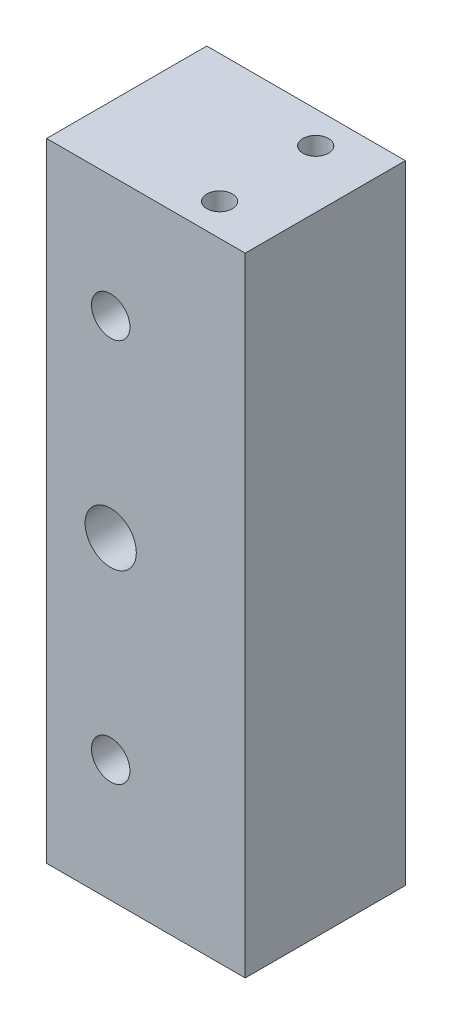
ISO-10303-21;
HEADER;
FILE_DESCRIPTION(('STEP AP214'),'2;1');
FILE_NAME('part.step','',(''),(''),'','','');
FILE_SCHEMA(('AUTOMOTIVE_DESIGN { 1 0 10303 214 1 1 1 1 }'));
ENDSEC;
DATA;
#1=APPLICATION_CONTEXT('core data for automotive mechanical design processes');
#2=APPLICATION_PROTOCOL_DEFINITION('international standard','automotive_design',2000,#1);
#3=PRODUCT_CONTEXT('',#1,'mechanical');
#4=PRODUCT('Part','Part','',(#3));
#5=PRODUCT_RELATED_PRODUCT_CATEGORY('part','',(#4));
#6=PRODUCT_DEFINITION_FORMATION('','',#4);
#7=PRODUCT_DEFINITION_CONTEXT('part definition',#1,'design');
#8=PRODUCT_DEFINITION('design','',#6,#7);
#9=PRODUCT_DEFINITION_SHAPE('','',#8);
#10=(LENGTH_UNIT() NAMED_UNIT(*) SI_UNIT(.MILLI.,.METRE.));
#11=(NAMED_UNIT(*) PLANE_ANGLE_UNIT() SI_UNIT($,.RADIAN.));
#12=(NAMED_UNIT(*) SI_UNIT($,.STERADIAN.) SOLID_ANGLE_UNIT());
#13=UNCERTAINTY_MEASURE_WITH_UNIT(LENGTH_MEASURE(1.E-05),#10,'distance_accuracy_value','');
#14=(GEOMETRIC_REPRESENTATION_CONTEXT(3) GLOBAL_UNCERTAINTY_ASSIGNED_CONTEXT((#13)) GLOBAL_UNIT_ASSIGNED_CONTEXT((#10,
#11,#12)) REPRESENTATION_CONTEXT('',''));
#15=CARTESIAN_POINT('',(0.,0.,0.));
#16=DIRECTION('',(0.,0.,1.));
#17=DIRECTION('',(1.,0.,0.));
#18=AXIS2_PLACEMENT_3D('',#15,#16,#17);
#19=CARTESIAN_POINT('',(0.,0.,25.));
#20=DIRECTION('',(0.,0.,-1.));
#21=DIRECTION('',(-1.,0.,0.));
#22=AXIS2_PLACEMENT_3D('',#19,#20,#21);
#23=PLANE('',#22);
#24=DIRECTION('',(1.,0.,0.));
#25=VECTOR('',#24,1.);
#26=CARTESIAN_POINT('',(-10.,-49.,25.));
#27=LINE('',#26,#25);
#28=CARTESIAN_POINT('',(-10.,-49.,25.));
#29=VERTEX_POINT('',#28);
#30=CARTESIAN_POINT('',(21.,-49.,25.));
#31=VERTEX_POINT('',#30);
#32=EDGE_CURVE('E67',#29,#31,#27,.T.);
#33=ORIENTED_EDGE('',*,*,#32,.T.);
#34=DIRECTION('',(0.,-1.,0.));
#35=VECTOR('',#34,1.);
#36=CARTESIAN_POINT('',(21.,-49.,25.));
#37=LINE('',#36,#35);
#38=CARTESIAN_POINT('',(21.,49.,25.));
#39=VERTEX_POINT('',#38);
#40=EDGE_CURVE('E94',#39,#31,#37,.T.);
#41=ORIENTED_EDGE('',*,*,#40,.F.);
#42=DIRECTION('',(-1.,0.,0.));
#43=VECTOR('',#42,1.);
#44=CARTESIAN_POINT('',(-10.,49.,25.));
#45=LINE('',#44,#43);
#46=CARTESIAN_POINT('',(-10.,49.,25.));
#47=VERTEX_POINT('',#46);
#48=EDGE_CURVE('E86',#39,#47,#45,.T.);
#49=ORIENTED_EDGE('',*,*,#48,.T.);
#50=DIRECTION('',(0.,-1.,0.));
#51=VECTOR('',#50,1.);
#52=CARTESIAN_POINT('',(-10.,-49.,25.));
#53=LINE('',#52,#51);
#54=EDGE_CURVE('E50',#47,#29,#53,.T.);
#55=ORIENTED_EDGE('',*,*,#54,.T.);
#56=EDGE_LOOP('',(#33,#41,#49,#55));
#57=FACE_BOUND('',#56,.T.);
#58=CARTESIAN_POINT('',(0.,0.,25.));
#59=DIRECTION('',(0.,0.,1.));
#60=DIRECTION('',(1.,0.,0.));
#61=AXIS2_PLACEMENT_3D('',#58,#59,#60);
#62=CIRCLE('',#61,4.);
#63=CARTESIAN_POINT('',(4.,0.,25.));
#64=VERTEX_POINT('',#63);
#65=EDGE_CURVE('E121',#64,#64,#62,.T.);
#66=ORIENTED_EDGE('',*,*,#65,.F.);
#67=EDGE_LOOP('',(#66));
#68=FACE_BOUND('',#67,.T.);
#69=CARTESIAN_POINT('',(0.,-30.,25.));
#70=DIRECTION('',(0.,0.,1.));
#71=DIRECTION('',(1.,0.,0.));
#72=AXIS2_PLACEMENT_3D('',#69,#70,#71);
#73=CIRCLE('',#72,3.);
#74=CARTESIAN_POINT('',(3.00000000000001,-30.,25.));
#75=VERTEX_POINT('',#74);
#76=EDGE_CURVE('E115',#75,#75,#73,.T.);
#77=ORIENTED_EDGE('',*,*,#76,.F.);
#78=EDGE_LOOP('',(#77));
#79=FACE_BOUND('',#78,.T.);
#80=CARTESIAN_POINT('',(0.,30.,25.));
#81=DIRECTION('',(0.,0.,1.));
#82=DIRECTION('',(1.,0.,0.));
#83=AXIS2_PLACEMENT_3D('',#80,#81,#82);
#84=CIRCLE('',#83,3.);
#85=CARTESIAN_POINT('',(3.,30.,25.));
#86=VERTEX_POINT('',#85);
#87=EDGE_CURVE('E109',#86,#86,#84,.T.);
#88=ORIENTED_EDGE('',*,*,#87,.F.);
#89=EDGE_LOOP('',(#88));
#90=FACE_BOUND('',#89,.T.);
#91=ADVANCED_FACE('F33',(#57,#68,#79,#90),#23,.F.);
#92=CARTESIAN_POINT('',(0.,0.,0.));
#93=DIRECTION('',(0.,0.,-1.));
#94=DIRECTION('',(-1.,0.,0.));
#95=AXIS2_PLACEMENT_3D('',#92,#93,#94);
#96=PLANE('',#95);
#97=CARTESIAN_POINT('',(0.,-30.,0.));
#98=DIRECTION('',(0.,0.,1.));
#99=DIRECTION('',(1.,0.,0.));
#100=AXIS2_PLACEMENT_3D('',#97,#98,#99);
#101=CIRCLE('',#100,3.);
#102=CARTESIAN_POINT('',(3.00000000000001,-30.,0.));
#103=VERTEX_POINT('',#102);
#104=EDGE_CURVE('E112',#103,#103,#101,.T.);
#105=ORIENTED_EDGE('',*,*,#104,.T.);
#106=EDGE_LOOP('',(#105));
#107=FACE_BOUND('',#106,.T.);
#108=DIRECTION('',(-1.,0.,0.));
#109=VECTOR('',#108,1.);
#110=CARTESIAN_POINT('',(-10.,49.,0.));
#111=LINE('',#110,#109);
#112=CARTESIAN_POINT('',(21.,49.,0.));
#113=VERTEX_POINT('',#112);
#114=CARTESIAN_POINT('',(-10.,49.,0.));
#115=VERTEX_POINT('',#114);
#116=EDGE_CURVE('E61',#113,#115,#111,.T.);
#117=ORIENTED_EDGE('',*,*,#116,.F.);
#118=DIRECTION('',(0.,-1.,0.));
#119=VECTOR('',#118,1.);
#120=CARTESIAN_POINT('',(21.,-49.,0.));
#121=LINE('',#120,#119);
#122=CARTESIAN_POINT('',(21.,-49.,0.));
#123=VERTEX_POINT('',#122);
#124=EDGE_CURVE('E93',#113,#123,#121,.T.);
#125=ORIENTED_EDGE('',*,*,#124,.T.);
#126=DIRECTION('',(1.,0.,0.));
#127=VECTOR('',#126,1.);
#128=CARTESIAN_POINT('',(-10.,-49.,0.));
#129=LINE('',#128,#127);
#130=CARTESIAN_POINT('',(-10.,-49.,0.));
#131=VERTEX_POINT('',#130);
#132=EDGE_CURVE('E78',#131,#123,#129,.T.);
#133=ORIENTED_EDGE('',*,*,#132,.F.);
#134=DIRECTION('',(0.,-1.,0.));
#135=VECTOR('',#134,1.);
#136=CARTESIAN_POINT('',(-10.,-49.,0.));
#137=LINE('',#136,#135);
#138=EDGE_CURVE('E87',#115,#131,#137,.T.);
#139=ORIENTED_EDGE('',*,*,#138,.F.);
#140=EDGE_LOOP('',(#117,#125,#133,#139));
#141=FACE_BOUND('',#140,.T.);
#142=CARTESIAN_POINT('',(0.,0.,0.));
#143=DIRECTION('',(0.,0.,1.));
#144=DIRECTION('',(1.,0.,0.));
#145=AXIS2_PLACEMENT_3D('',#142,#143,#144);
#146=CIRCLE('',#145,4.);
#147=CARTESIAN_POINT('',(4.,0.,0.));
#148=VERTEX_POINT('',#147);
#149=EDGE_CURVE('E118',#148,#148,#146,.T.);
#150=ORIENTED_EDGE('',*,*,#149,.T.);
#151=EDGE_LOOP('',(#150));
#152=FACE_BOUND('',#151,.T.);
#153=CARTESIAN_POINT('',(0.,30.,0.));
#154=DIRECTION('',(0.,0.,1.));
#155=DIRECTION('',(1.,0.,0.));
#156=AXIS2_PLACEMENT_3D('',#153,#154,#155);
#157=CIRCLE('',#156,3.);
#158=CARTESIAN_POINT('',(3.,30.,0.));
#159=VERTEX_POINT('',#158);
#160=EDGE_CURVE('E95',#159,#159,#157,.T.);
#161=ORIENTED_EDGE('',*,*,#160,.T.);
#162=EDGE_LOOP('',(#161));
#163=FACE_BOUND('',#162,.T.);
#164=ADVANCED_FACE('F98',(#107,#141,#152,#163),#96,.T.);
#165=CARTESIAN_POINT('',(-10.,49.,25.));
#166=DIRECTION('',(0.,-1.,0.));
#167=DIRECTION('',(0.,0.,-1.));
#168=AXIS2_PLACEMENT_3D('',#165,#166,#167);
#169=PLANE('',#168);
#170=CARTESIAN_POINT('',(12.,49.,5.));
#171=DIRECTION('',(0.,1.,0.));
#172=DIRECTION('',(0.,0.,1.));
#173=AXIS2_PLACEMENT_3D('',#170,#171,#172);
#174=CIRCLE('',#173,2.);
#175=CARTESIAN_POINT('',(12.,49.,7.));
#176=VERTEX_POINT('',#175);
#177=EDGE_CURVE('E104',#176,#176,#174,.T.);
#178=ORIENTED_EDGE('',*,*,#177,.F.);
#179=EDGE_LOOP('',(#178));
#180=FACE_BOUND('',#179,.T.);
#181=CARTESIAN_POINT('',(12.,49.,20.));
#182=DIRECTION('',(0.,1.,0.));
#183=DIRECTION('',(0.,0.,1.));
#184=AXIS2_PLACEMENT_3D('',#181,#182,#183);
#185=CIRCLE('',#184,2.00000000000001);
#186=CARTESIAN_POINT('',(12.,49.,22.));
#187=VERTEX_POINT('',#186);
#188=EDGE_CURVE('E315',#187,#187,#185,.T.);
#189=ORIENTED_EDGE('',*,*,#188,.F.);
#190=EDGE_LOOP('',(#189));
#191=FACE_BOUND('',#190,.T.);
#192=ORIENTED_EDGE('',*,*,#116,.T.);
#193=DIRECTION('',(0.,0.,-1.));
#194=VECTOR('',#193,1.);
#195=CARTESIAN_POINT('',(-10.,49.,25.));
#196=LINE('',#195,#194);
#197=EDGE_CURVE('E11',#47,#115,#196,.T.);
#198=ORIENTED_EDGE('',*,*,#197,.F.);
#199=ORIENTED_EDGE('',*,*,#48,.F.);
#200=DIRECTION('',(0.,0.,-1.));
#201=VECTOR('',#200,1.);
#202=CARTESIAN_POINT('',(21.,49.,25.));
#203=LINE('',#202,#201);
#204=EDGE_CURVE('E96',#39,#113,#203,.T.);
#205=ORIENTED_EDGE('',*,*,#204,.T.);
#206=EDGE_LOOP('',(#192,#198,#199,#205));
#207=FACE_BOUND('',#206,.T.);
#208=ADVANCED_FACE('F35',(#180,#191,#207),#169,.F.);
#209=CARTESIAN_POINT('',(-10.,-49.,25.));
#210=DIRECTION('',(1.,0.,0.));
#211=DIRECTION('',(0.,0.,-1.));
#212=AXIS2_PLACEMENT_3D('',#209,#210,#211);
#213=PLANE('',#212);
#214=ORIENTED_EDGE('',*,*,#138,.T.);
#215=DIRECTION('',(0.,0.,-1.));
#216=VECTOR('',#215,1.);
#217=CARTESIAN_POINT('',(-10.,-49.,25.));
#218=LINE('',#217,#216);
#219=EDGE_CURVE('E42',#29,#131,#218,.T.);
#220=ORIENTED_EDGE('',*,*,#219,.F.);
#221=ORIENTED_EDGE('',*,*,#54,.F.);
#222=ORIENTED_EDGE('',*,*,#197,.T.);
#223=EDGE_LOOP('',(#214,#220,#221,#222));
#224=FACE_BOUND('',#223,.T.);
#225=ADVANCED_FACE('F131',(#224),#213,.F.);
#226=CARTESIAN_POINT('',(-10.,-49.,25.));
#227=DIRECTION('',(0.,1.,0.));
#228=DIRECTION('',(0.,0.,1.));
#229=AXIS2_PLACEMENT_3D('',#226,#227,#228);
#230=PLANE('',#229);
#231=CARTESIAN_POINT('',(12.,-49.,5.));
#232=DIRECTION('',(0.,1.,0.));
#233=DIRECTION('',(0.,0.,1.));
#234=AXIS2_PLACEMENT_3D('',#231,#232,#233);
#235=CIRCLE('',#234,2.);
#236=CARTESIAN_POINT('',(12.,-49.,7.));
#237=VERTEX_POINT('',#236);
#238=EDGE_CURVE('E316',#237,#237,#235,.T.);
#239=ORIENTED_EDGE('',*,*,#238,.T.);
#240=EDGE_LOOP('',(#239));
#241=FACE_BOUND('',#240,.T.);
#242=CARTESIAN_POINT('',(12.,-49.,20.));
#243=DIRECTION('',(0.,1.,0.));
#244=DIRECTION('',(0.,0.,1.));
#245=AXIS2_PLACEMENT_3D('',#242,#243,#244);
#246=CIRCLE('',#245,2.00000000000001);
#247=CARTESIAN_POINT('',(12.,-49.,22.));
#248=VERTEX_POINT('',#247);
#249=EDGE_CURVE('E326',#248,#248,#246,.T.);
#250=ORIENTED_EDGE('',*,*,#249,.T.);
#251=EDGE_LOOP('',(#250));
#252=FACE_BOUND('',#251,.T.);
#253=ORIENTED_EDGE('',*,*,#132,.T.);
#254=DIRECTION('',(0.,0.,-1.));
#255=VECTOR('',#254,1.);
#256=CARTESIAN_POINT('',(21.,-49.,25.));
#257=LINE('',#256,#255);
#258=EDGE_CURVE('E81',#31,#123,#257,.T.);
#259=ORIENTED_EDGE('',*,*,#258,.F.);
#260=ORIENTED_EDGE('',*,*,#32,.F.);
#261=ORIENTED_EDGE('',*,*,#219,.T.);
#262=EDGE_LOOP('',(#253,#259,#260,#261));
#263=FACE_BOUND('',#262,.T.);
#264=ADVANCED_FACE('F80',(#241,#252,#263),#230,.F.);
#265=CARTESIAN_POINT('',(0.,0.,25.));
#266=DIRECTION('',(0.,0.,-1.));
#267=DIRECTION('',(-1.,0.,0.));
#268=AXIS2_PLACEMENT_3D('',#265,#266,#267);
#269=CYLINDRICAL_SURFACE('',#268,4.);
#270=ORIENTED_EDGE('',*,*,#65,.T.);
#271=EDGE_LOOP('',(#270));
#272=FACE_BOUND('',#271,.T.);
#273=ORIENTED_EDGE('',*,*,#149,.F.);
#274=EDGE_LOOP('',(#273));
#275=FACE_BOUND('',#274,.T.);
#276=ADVANCED_FACE('F158',(#272,#275),#269,.F.);
#277=CARTESIAN_POINT('',(0.,-30.,25.));
#278=DIRECTION('',(0.,0.,-1.));
#279=DIRECTION('',(-1.,0.,0.));
#280=AXIS2_PLACEMENT_3D('',#277,#278,#279);
#281=CYLINDRICAL_SURFACE('',#280,3.);
#282=ORIENTED_EDGE('',*,*,#76,.T.);
#283=EDGE_LOOP('',(#282));
#284=FACE_BOUND('',#283,.T.);
#285=ORIENTED_EDGE('',*,*,#104,.F.);
#286=EDGE_LOOP('',(#285));
#287=FACE_BOUND('',#286,.T.);
#288=ADVANCED_FACE('F144',(#284,#287),#281,.F.);
#289=CARTESIAN_POINT('',(0.,30.,25.));
#290=DIRECTION('',(0.,0.,-1.));
#291=DIRECTION('',(-1.,0.,0.));
#292=AXIS2_PLACEMENT_3D('',#289,#290,#291);
#293=CYLINDRICAL_SURFACE('',#292,3.);
#294=ORIENTED_EDGE('',*,*,#87,.T.);
#295=EDGE_LOOP('',(#294));
#296=FACE_BOUND('',#295,.T.);
#297=ORIENTED_EDGE('',*,*,#160,.F.);
#298=EDGE_LOOP('',(#297));
#299=FACE_BOUND('',#298,.T.);
#300=ADVANCED_FACE('F141',(#296,#299),#293,.F.);
#301=CARTESIAN_POINT('',(21.,-49.,25.));
#302=DIRECTION('',(1.,0.,0.));
#303=DIRECTION('',(0.,0.,-1.));
#304=AXIS2_PLACEMENT_3D('',#301,#302,#303);
#305=PLANE('',#304);
#306=ORIENTED_EDGE('',*,*,#124,.F.);
#307=ORIENTED_EDGE('',*,*,#204,.F.);
#308=ORIENTED_EDGE('',*,*,#40,.T.);
#309=ORIENTED_EDGE('',*,*,#258,.T.);
#310=EDGE_LOOP('',(#306,#307,#308,#309));
#311=FACE_BOUND('',#310,.T.);
#312=ADVANCED_FACE('F91',(#311),#305,.T.);
#313=CARTESIAN_POINT('',(12.,24.,20.));
#314=DIRECTION('',(0.,1.,0.));
#315=DIRECTION('',(0.,0.,1.));
#316=AXIS2_PLACEMENT_3D('',#313,#314,#315);
#317=CYLINDRICAL_SURFACE('',#316,2.00000000000001);
#318=CARTESIAN_POINT('',(12.,24.,20.));
#319=DIRECTION('',(0.,1.,0.));
#320=DIRECTION('',(0.,0.,1.));
#321=AXIS2_PLACEMENT_3D('',#318,#319,#320);
#322=CIRCLE('',#321,2.00000000000001);
#323=CARTESIAN_POINT('',(12.,24.,22.));
#324=VERTEX_POINT('',#323);
#325=EDGE_CURVE('E319',#324,#324,#322,.T.);
#326=ORIENTED_EDGE('',*,*,#325,.F.);
#327=EDGE_LOOP('',(#326));
#328=FACE_BOUND('',#327,.T.);
#329=ORIENTED_EDGE('',*,*,#188,.T.);
#330=EDGE_LOOP('',(#329));
#331=FACE_BOUND('',#330,.T.);
#332=ADVANCED_FACE('F195',(#328,#331),#317,.F.);
#333=CARTESIAN_POINT('',(12.,24.,20.));
#334=DIRECTION('',(0.,1.,0.));
#335=DIRECTION('',(0.,0.,1.));
#336=AXIS2_PLACEMENT_3D('',#333,#334,#335);
#337=PLANE('',#336);
#338=ORIENTED_EDGE('',*,*,#325,.T.);
#339=EDGE_LOOP('',(#338));
#340=FACE_BOUND('',#339,.T.);
#341=ADVANCED_FACE('F202',(#340),#337,.T.);
#342=CARTESIAN_POINT('',(12.,24.,5.));
#343=DIRECTION('',(0.,1.,0.));
#344=DIRECTION('',(0.,0.,1.));
#345=AXIS2_PLACEMENT_3D('',#342,#343,#344);
#346=CYLINDRICAL_SURFACE('',#345,2.);
#347=CARTESIAN_POINT('',(12.,24.,5.));
#348=DIRECTION('',(0.,1.,0.));
#349=DIRECTION('',(0.,0.,1.));
#350=AXIS2_PLACEMENT_3D('',#347,#348,#349);
#351=CIRCLE('',#350,2.);
#352=CARTESIAN_POINT('',(12.,24.,7.));
#353=VERTEX_POINT('',#352);
#354=EDGE_CURVE('E100',#353,#353,#351,.T.);
#355=ORIENTED_EDGE('',*,*,#354,.F.);
#356=EDGE_LOOP('',(#355));
#357=FACE_BOUND('',#356,.T.);
#358=ORIENTED_EDGE('',*,*,#177,.T.);
#359=EDGE_LOOP('',(#358));
#360=FACE_BOUND('',#359,.T.);
#361=ADVANCED_FACE('F210',(#357,#360),#346,.F.);
#362=CARTESIAN_POINT('',(12.,24.,5.));
#363=DIRECTION('',(0.,1.,0.));
#364=DIRECTION('',(0.,0.,1.));
#365=AXIS2_PLACEMENT_3D('',#362,#363,#364);
#366=PLANE('',#365);
#367=ORIENTED_EDGE('',*,*,#354,.T.);
#368=EDGE_LOOP('',(#367));
#369=FACE_BOUND('',#368,.T.);
#370=ADVANCED_FACE('F218',(#369),#366,.T.);
#371=CARTESIAN_POINT('',(12.,-24.,20.));
#372=DIRECTION('',(0.,-1.,0.));
#373=DIRECTION('',(0.,0.,-1.));
#374=AXIS2_PLACEMENT_3D('',#371,#372,#373);
#375=CYLINDRICAL_SURFACE('',#374,2.00000000000001);
#376=CARTESIAN_POINT('',(12.,-24.,20.));
#377=DIRECTION('',(0.,1.,0.));
#378=DIRECTION('',(0.,0.,1.));
#379=AXIS2_PLACEMENT_3D('',#376,#377,#378);
#380=CIRCLE('',#379,2.00000000000001);
#381=CARTESIAN_POINT('',(12.,-24.,22.));
#382=VERTEX_POINT('',#381);
#383=EDGE_CURVE('E321',#382,#382,#380,.T.);
#384=ORIENTED_EDGE('',*,*,#383,.T.);
#385=EDGE_LOOP('',(#384));
#386=FACE_BOUND('',#385,.T.);
#387=ORIENTED_EDGE('',*,*,#249,.F.);
#388=EDGE_LOOP('',(#387));
#389=FACE_BOUND('',#388,.T.);
#390=ADVANCED_FACE('F225',(#386,#389),#375,.F.);
#391=CARTESIAN_POINT('',(12.,-24.,20.));
#392=DIRECTION('',(0.,-1.,0.));
#393=DIRECTION('',(0.,0.,1.));
#394=AXIS2_PLACEMENT_3D('',#391,#392,#393);
#395=PLANE('',#394);
#396=ORIENTED_EDGE('',*,*,#383,.F.);
#397=EDGE_LOOP('',(#396));
#398=FACE_BOUND('',#397,.T.);
#399=ADVANCED_FACE('F232',(#398),#395,.T.);
#400=CARTESIAN_POINT('',(12.,-24.,5.));
#401=DIRECTION('',(0.,-1.,0.));
#402=DIRECTION('',(0.,0.,-1.));
#403=AXIS2_PLACEMENT_3D('',#400,#401,#402);
#404=CYLINDRICAL_SURFACE('',#403,2.);
#405=CARTESIAN_POINT('',(12.,-24.,5.));
#406=DIRECTION('',(0.,1.,0.));
#407=DIRECTION('',(0.,0.,1.));
#408=AXIS2_PLACEMENT_3D('',#405,#406,#407);
#409=CIRCLE('',#408,2.);
#410=CARTESIAN_POINT('',(12.,-24.,7.));
#411=VERTEX_POINT('',#410);
#412=EDGE_CURVE('E314',#411,#411,#409,.T.);
#413=ORIENTED_EDGE('',*,*,#412,.T.);
#414=EDGE_LOOP('',(#413));
#415=FACE_BOUND('',#414,.T.);
#416=ORIENTED_EDGE('',*,*,#238,.F.);
#417=EDGE_LOOP('',(#416));
#418=FACE_BOUND('',#417,.T.);
#419=ADVANCED_FACE('F240',(#415,#418),#404,.F.);
#420=CARTESIAN_POINT('',(12.,-24.,5.));
#421=DIRECTION('',(0.,-1.,0.));
#422=DIRECTION('',(0.,0.,1.));
#423=AXIS2_PLACEMENT_3D('',#420,#421,#422);
#424=PLANE('',#423);
#425=ORIENTED_EDGE('',*,*,#412,.F.);
#426=EDGE_LOOP('',(#425));
#427=FACE_BOUND('',#426,.T.);
#428=ADVANCED_FACE('F248',(#427),#424,.T.);
#429=CLOSED_SHELL('',(#91,#164,#208,#225,#264,#276,#288,#300,#312,#332,#341,#361,#370,#390,#399,
#419,#428));
#430=MANIFOLD_SOLID_BREP('B2',#429);
#431=ADVANCED_BREP_SHAPE_REPRESENTATION('',(#18,#430),#14);
#432=SHAPE_DEFINITION_REPRESENTATION(#9,#431);
ENDSEC;
END-ISO-10303-21;
